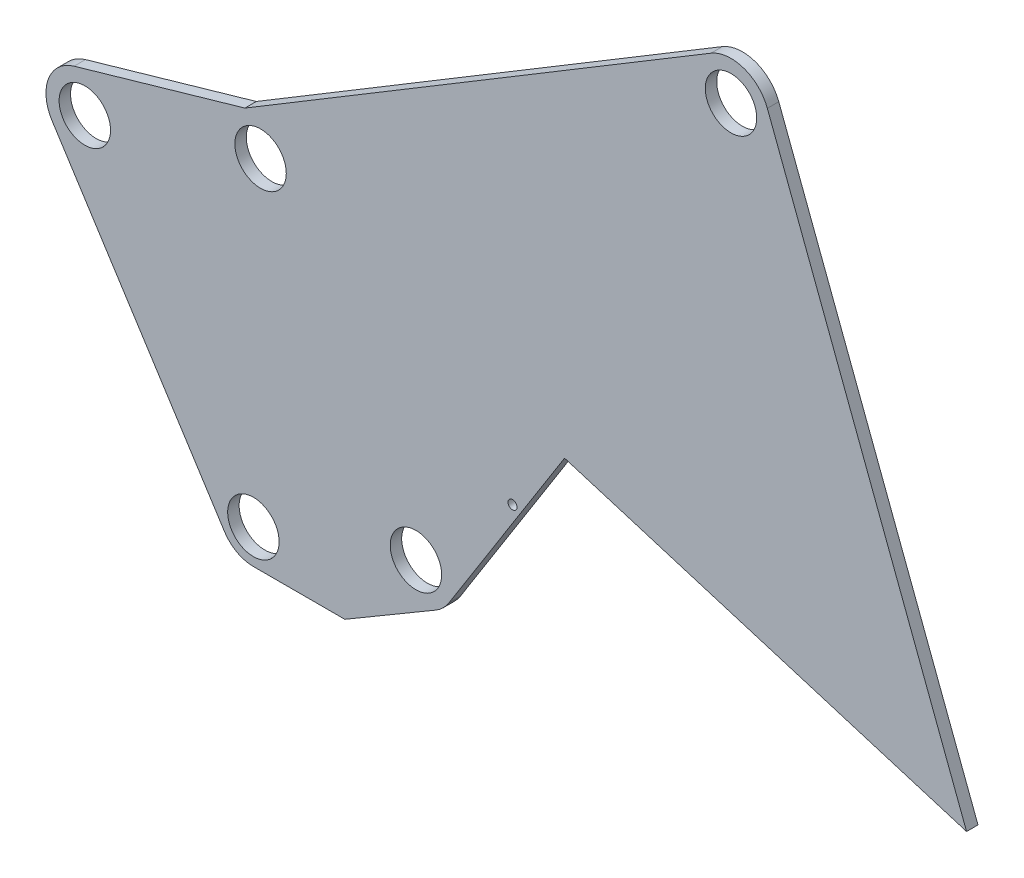
ISO-10303-21;
HEADER;
FILE_DESCRIPTION(('STEP AP214'),'2;1');
FILE_NAME('part.step','',(''),(''),'','','');
FILE_SCHEMA(('AUTOMOTIVE_DESIGN { 1 0 10303 214 1 1 1 1 }'));
ENDSEC;
DATA;
#1=APPLICATION_CONTEXT('core data for automotive mechanical design processes');
#2=APPLICATION_PROTOCOL_DEFINITION('international standard','automotive_design',2000,#1);
#3=PRODUCT_CONTEXT('',#1,'mechanical');
#4=PRODUCT('Part','Part','',(#3));
#5=PRODUCT_RELATED_PRODUCT_CATEGORY('part','',(#4));
#6=PRODUCT_DEFINITION_FORMATION('','',#4);
#7=PRODUCT_DEFINITION_CONTEXT('part definition',#1,'design');
#8=PRODUCT_DEFINITION('design','',#6,#7);
#9=PRODUCT_DEFINITION_SHAPE('','',#8);
#10=(LENGTH_UNIT() NAMED_UNIT(*) SI_UNIT(.MILLI.,.METRE.));
#11=(NAMED_UNIT(*) PLANE_ANGLE_UNIT() SI_UNIT($,.RADIAN.));
#12=(NAMED_UNIT(*) SI_UNIT($,.STERADIAN.) SOLID_ANGLE_UNIT());
#13=UNCERTAINTY_MEASURE_WITH_UNIT(LENGTH_MEASURE(1.E-05),#10,'distance_accuracy_value','');
#14=(GEOMETRIC_REPRESENTATION_CONTEXT(3) GLOBAL_UNCERTAINTY_ASSIGNED_CONTEXT((#13)) GLOBAL_UNIT_ASSIGNED_CONTEXT((#10,
#11,#12)) REPRESENTATION_CONTEXT('',''));
#15=CARTESIAN_POINT('',(0.,0.,0.));
#16=DIRECTION('',(0.,0.,1.));
#17=DIRECTION('',(1.,0.,0.));
#18=AXIS2_PLACEMENT_3D('',#15,#16,#17);
#19=CARTESIAN_POINT('',(-28.401709478263,48.3241414593411,6.35));
#20=DIRECTION('',(-0.506698596321132,0.862123269890214,0.));
#21=DIRECTION('',(-0.862123269890214,-0.506698596321132,0.));
#22=AXIS2_PLACEMENT_3D('',#19,#20,#21);
#23=PLANE('',#22);
#24=DIRECTION('',(0.862123269890214,0.506698596321132,0.));
#25=VECTOR('',#24,1.);
#26=CARTESIAN_POINT('',(-28.401709478263,48.3241414593411,0.));
#27=LINE('',#26,#25);
#28=CARTESIAN_POINT('',(-110.622909915789,3.67206265394771E-11,0.));
#29=VERTEX_POINT('',#28);
#30=CARTESIAN_POINT('',(-60.1803773054267,29.646758603154,0.));
#31=VERTEX_POINT('',#30);
#32=EDGE_CURVE('E198',#29,#31,#27,.T.);
#33=ORIENTED_EDGE('',*,*,#32,.T.);
#34=DIRECTION('',(0.,0.,-1.));
#35=VECTOR('',#34,1.);
#36=CARTESIAN_POINT('',(-60.1803773054267,29.646758603154,6.35));
#37=LINE('',#36,#35);
#38=CARTESIAN_POINT('',(-60.1803773054267,29.646758603154,6.35));
#39=VERTEX_POINT('',#38);
#40=EDGE_CURVE('E11',#39,#31,#37,.T.);
#41=ORIENTED_EDGE('',*,*,#40,.F.);
#42=DIRECTION('',(0.862123269890214,0.506698596321132,0.));
#43=VECTOR('',#42,1.);
#44=CARTESIAN_POINT('',(-28.401709478263,48.3241414593411,6.35));
#45=LINE('',#44,#43);
#46=CARTESIAN_POINT('',(-110.622909915789,3.67206265394771E-11,6.35));
#47=VERTEX_POINT('',#46);
#48=EDGE_CURVE('E263',#47,#39,#45,.T.);
#49=ORIENTED_EDGE('',*,*,#48,.F.);
#50=DIRECTION('',(0.,0.,-1.));
#51=VECTOR('',#50,1.);
#52=CARTESIAN_POINT('',(-110.622909915789,3.67206265394771E-11,6.35));
#53=LINE('',#52,#51);
#54=EDGE_CURVE('E197',#47,#29,#53,.T.);
#55=ORIENTED_EDGE('',*,*,#54,.T.);
#56=EDGE_LOOP('',(#33,#41,#49,#55));
#57=FACE_BOUND('',#56,.T.);
#58=ADVANCED_FACE('F45',(#57),#23,.F.);
#59=CARTESIAN_POINT('',(-71.1199999999939,48.2600000000735,6.35));
#60=DIRECTION('',(0.,0.,-1.));
#61=DIRECTION('',(-1.,0.,0.));
#62=AXIS2_PLACEMENT_3D('',#59,#60,#61);
#63=CYLINDRICAL_SURFACE('',#62,21.5899999999761);
#64=CARTESIAN_POINT('',(-71.1199999999939,48.2600000000735,0.));
#65=DIRECTION('',(0.,0.,1.));
#66=DIRECTION('',(1.,0.,0.));
#67=AXIS2_PLACEMENT_3D('',#64,#65,#66);
#68=CIRCLE('',#67,21.5899999999761);
#69=CARTESIAN_POINT('',(-52.8649638181614,36.732565159682,0.));
#70=VERTEX_POINT('',#69);
#71=EDGE_CURVE('E202',#31,#70,#68,.T.);
#72=ORIENTED_EDGE('',*,*,#71,.T.);
#73=DIRECTION('',(0.,0.,-1.));
#74=VECTOR('',#73,1.);
#75=CARTESIAN_POINT('',(-52.8649638181614,36.732565159682,6.35));
#76=LINE('',#75,#74);
#77=CARTESIAN_POINT('',(-52.8649638181614,36.732565159682,6.35));
#78=VERTEX_POINT('',#77);
#79=EDGE_CURVE('E54',#78,#70,#76,.T.);
#80=ORIENTED_EDGE('',*,*,#79,.F.);
#81=CARTESIAN_POINT('',(-71.1199999999939,48.2600000000735,6.35));
#82=DIRECTION('',(0.,0.,1.));
#83=DIRECTION('',(1.,0.,0.));
#84=AXIS2_PLACEMENT_3D('',#81,#82,#83);
#85=CIRCLE('',#84,21.5899999999761);
#86=EDGE_CURVE('E116',#39,#78,#85,.T.);
#87=ORIENTED_EDGE('',*,*,#86,.F.);
#88=ORIENTED_EDGE('',*,*,#40,.T.);
#89=EDGE_LOOP('',(#72,#80,#87,#88));
#90=FACE_BOUND('',#89,.T.);
#91=ADVANCED_FACE('F295',(#90),#63,.T.);
#92=CARTESIAN_POINT('',(-54.377384872712,34.3374702009576,6.35));
#93=DIRECTION('',(0.845532013980666,-0.533924726280585,0.));
#94=DIRECTION('',(0.533924726280585,0.845532013980667,0.));
#95=AXIS2_PLACEMENT_3D('',#92,#93,#94);
#96=PLANE('',#95);
#97=DIRECTION('',(-0.533924726280585,-0.845532013980667,0.));
#98=VECTOR('',#97,1.);
#99=CARTESIAN_POINT('',(-54.377384872712,34.3374702009576,0.));
#100=LINE('',#99,#98);
#101=CARTESIAN_POINT('',(11.4463859597402,138.577080730845,0.));
#102=VERTEX_POINT('',#101);
#103=EDGE_CURVE('E206',#102,#70,#100,.T.);
#104=ORIENTED_EDGE('',*,*,#103,.F.);
#105=DIRECTION('',(0.,0.,-1.));
#106=VECTOR('',#105,1.);
#107=CARTESIAN_POINT('',(11.4463859597402,138.577080730845,6.35));
#108=LINE('',#107,#106);
#109=CARTESIAN_POINT('',(11.4463859597402,138.577080730845,6.35));
#110=VERTEX_POINT('',#109);
#111=EDGE_CURVE('E286',#110,#102,#108,.T.);
#112=ORIENTED_EDGE('',*,*,#111,.F.);
#113=DIRECTION('',(-0.533924726280585,-0.845532013980667,0.));
#114=VECTOR('',#113,1.);
#115=CARTESIAN_POINT('',(-54.377384872712,34.3374702009576,6.35));
#116=LINE('',#115,#114);
#117=EDGE_CURVE('E294',#110,#78,#116,.T.);
#118=ORIENTED_EDGE('',*,*,#117,.T.);
#119=ORIENTED_EDGE('',*,*,#79,.T.);
#120=EDGE_LOOP('',(#104,#112,#118,#119));
#121=FACE_BOUND('',#120,.T.);
#122=ADVANCED_FACE('F292',(#121),#96,.T.);
#123=CARTESIAN_POINT('',(39.5684231433015,130.018740093729,6.35));
#124=DIRECTION('',(-0.291144795275642,-0.956678999552046,0.));
#125=DIRECTION('',(0.956678999552047,-0.291144795275642,0.));
#126=AXIS2_PLACEMENT_3D('',#123,#124,#125);
#127=PLANE('',#126);
#128=DIRECTION('',(-0.956678999552047,0.291144795275642,0.));
#129=VECTOR('',#128,1.);
#130=CARTESIAN_POINT('',(39.5684231433015,130.018740093729,0.));
#131=LINE('',#130,#129);
#132=CARTESIAN_POINT('',(234.791292485708,70.6068345805613,0.));
#133=VERTEX_POINT('',#132);
#134=EDGE_CURVE('E210',#133,#102,#131,.T.);
#135=ORIENTED_EDGE('',*,*,#134,.F.);
#136=DIRECTION('',(0.,0.,-1.));
#137=VECTOR('',#136,1.);
#138=CARTESIAN_POINT('',(234.791292485708,70.6068345805613,6.35));
#139=LINE('',#138,#137);
#140=CARTESIAN_POINT('',(234.791292485708,70.6068345805613,6.35));
#141=VERTEX_POINT('',#140);
#142=EDGE_CURVE('E283',#141,#133,#139,.T.);
#143=ORIENTED_EDGE('',*,*,#142,.F.);
#144=DIRECTION('',(-0.956678999552047,0.291144795275642,0.));
#145=VECTOR('',#144,1.);
#146=CARTESIAN_POINT('',(39.5684231433015,130.018740093729,6.35));
#147=LINE('',#146,#145);
#148=EDGE_CURVE('E308',#141,#110,#147,.T.);
#149=ORIENTED_EDGE('',*,*,#148,.T.);
#150=ORIENTED_EDGE('',*,*,#111,.T.);
#151=EDGE_LOOP('',(#135,#143,#149,#150));
#152=FACE_BOUND('',#151,.T.);
#153=ADVANCED_FACE('F305',(#152),#127,.T.);
#154=CARTESIAN_POINT('',(228.770055306045,86.5265569341366,6.35));
#155=DIRECTION('',(0.93533372917064,0.353766611024476,0.));
#156=DIRECTION('',(-0.353766611024476,0.935333729170641,0.));
#157=AXIS2_PLACEMENT_3D('',#154,#155,#156);
#158=PLANE('',#157);
#159=DIRECTION('',(0.353766611024476,-0.93533372917064,0.));
#160=VECTOR('',#159,1.);
#161=CARTESIAN_POINT('',(228.770055306045,86.5265569341366,0.));
#162=LINE('',#161,#160);
#163=CARTESIAN_POINT('',(124.110934059133,363.237821132055,0.));
#164=VERTEX_POINT('',#163);
#165=EDGE_CURVE('E214',#164,#133,#162,.T.);
#166=ORIENTED_EDGE('',*,*,#165,.F.);
#167=DIRECTION('',(0.,0.,-1.));
#168=VECTOR('',#167,1.);
#169=CARTESIAN_POINT('',(124.110934059133,363.237821132055,6.35));
#170=LINE('',#169,#168);
#171=CARTESIAN_POINT('',(124.110934059133,363.237821132055,6.35));
#172=VERTEX_POINT('',#171);
#173=EDGE_CURVE('E280',#172,#164,#170,.T.);
#174=ORIENTED_EDGE('',*,*,#173,.F.);
#175=DIRECTION('',(0.353766611024476,-0.93533372917064,0.));
#176=VECTOR('',#175,1.);
#177=CARTESIAN_POINT('',(228.770055306045,86.5265569341366,6.35));
#178=LINE('',#177,#176);
#179=EDGE_CURVE('E315',#172,#141,#178,.T.);
#180=ORIENTED_EDGE('',*,*,#179,.T.);
#181=ORIENTED_EDGE('',*,*,#142,.T.);
#182=EDGE_LOOP('',(#166,#174,#180,#181));
#183=FACE_BOUND('',#182,.T.);
#184=ADVANCED_FACE('F532',(#183),#158,.T.);
#185=CARTESIAN_POINT('',(103.917078846339,355.600000000037,6.35));
#186=DIRECTION('',(0.,0.,-1.));
#187=DIRECTION('',(-1.,0.,0.));
#188=AXIS2_PLACEMENT_3D('',#185,#186,#187);
#189=CYLINDRICAL_SURFACE('',#188,21.59);
#190=CARTESIAN_POINT('',(103.917078846339,355.600000000037,0.));
#191=DIRECTION('',(0.,0.,1.));
#192=DIRECTION('',(1.,0.,0.));
#193=AXIS2_PLACEMENT_3D('',#190,#191,#192);
#194=CIRCLE('',#193,21.59);
#195=CARTESIAN_POINT('',(92.7821589025102,374.0970716019,0.));
#196=VERTEX_POINT('',#195);
#197=EDGE_CURVE('E218',#164,#196,#194,.T.);
#198=ORIENTED_EDGE('',*,*,#197,.T.);
#199=DIRECTION('',(0.,0.,-1.));
#200=VECTOR('',#199,1.);
#201=CARTESIAN_POINT('',(92.7821589025102,374.0970716019,6.35));
#202=LINE('',#201,#200);
#203=CARTESIAN_POINT('',(92.7821589025102,374.0970716019,6.35));
#204=VERTEX_POINT('',#203);
#205=EDGE_CURVE('E276',#204,#196,#202,.T.);
#206=ORIENTED_EDGE('',*,*,#205,.F.);
#207=CARTESIAN_POINT('',(103.917078846339,355.600000000037,6.35));
#208=DIRECTION('',(0.,0.,1.));
#209=DIRECTION('',(1.,0.,0.));
#210=AXIS2_PLACEMENT_3D('',#207,#208,#209);
#211=CIRCLE('',#210,21.59);
#212=EDGE_CURVE('E322',#172,#204,#211,.T.);
#213=ORIENTED_EDGE('',*,*,#212,.F.);
#214=ORIENTED_EDGE('',*,*,#173,.T.);
#215=EDGE_LOOP('',(#198,#206,#213,#214));
#216=FACE_BOUND('',#215,.T.);
#217=ADVANCED_FACE('F523',(#216),#189,.T.);
#218=CARTESIAN_POINT('',(-140.619240322013,233.59343129156,6.35));
#219=DIRECTION('',(0.515744323475217,-0.856742547562038,0.));
#220=DIRECTION('',(0.856742547562038,0.515744323475217,0.));
#221=AXIS2_PLACEMENT_3D('',#218,#219,#220);
#222=PLANE('',#221);
#223=DIRECTION('',(-0.856742547562038,-0.515744323475217,0.));
#224=VECTOR('',#223,1.);
#225=CARTESIAN_POINT('',(-140.619240322013,233.59343129156,0.));
#226=LINE('',#225,#224);
#227=CARTESIAN_POINT('',(-166.143530668681,218.228246155737,0.));
#228=VERTEX_POINT('',#227);
#229=EDGE_CURVE('E221',#196,#228,#226,.T.);
#230=ORIENTED_EDGE('',*,*,#229,.T.);
#231=DIRECTION('',(0.,0.,-1.));
#232=VECTOR('',#231,1.);
#233=CARTESIAN_POINT('',(-166.143530668681,218.228246155737,6.35));
#234=LINE('',#233,#232);
#235=CARTESIAN_POINT('',(-166.143530668681,218.228246155737,6.35));
#236=VERTEX_POINT('',#235);
#237=EDGE_CURVE('E273',#236,#228,#234,.T.);
#238=ORIENTED_EDGE('',*,*,#237,.F.);
#239=DIRECTION('',(-0.856742547562038,-0.515744323475217,0.));
#240=VECTOR('',#239,1.);
#241=CARTESIAN_POINT('',(-140.619240322013,233.59343129156,6.35));
#242=LINE('',#241,#240);
#243=EDGE_CURVE('E325',#204,#236,#242,.T.);
#244=ORIENTED_EDGE('',*,*,#243,.F.);
#245=ORIENTED_EDGE('',*,*,#205,.T.);
#246=EDGE_LOOP('',(#230,#238,#244,#245));
#247=FACE_BOUND('',#246,.T.);
#248=ADVANCED_FACE('F337',(#247),#222,.F.);
#249=CARTESIAN_POINT('',(-70.6696864904669,245.690103730274,6.35));
#250=DIRECTION('',(-0.27642947374798,0.961034206489766,0.));
#251=DIRECTION('',(-0.961034206489766,-0.27642947374798,0.));
#252=AXIS2_PLACEMENT_3D('',#249,#250,#251);
#253=PLANE('',#252);
#254=DIRECTION('',(0.961034206489766,0.27642947374798,0.));
#255=VECTOR('',#254,1.);
#256=CARTESIAN_POINT('',(-70.6696864904669,245.690103730274,0.));
#257=LINE('',#256,#255);
#258=CARTESIAN_POINT('',(-261.052984116868,190.928728518151,0.));
#259=VERTEX_POINT('',#258);
#260=EDGE_CURVE('E225',#259,#228,#257,.T.);
#261=ORIENTED_EDGE('',*,*,#260,.F.);
#262=DIRECTION('',(0.,0.,-1.));
#263=VECTOR('',#262,1.);
#264=CARTESIAN_POINT('',(-261.052984116868,190.928728518151,6.35));
#265=LINE('',#264,#263);
#266=CARTESIAN_POINT('',(-261.052984116868,190.928728518151,6.35));
#267=VERTEX_POINT('',#266);
#268=EDGE_CURVE('E270',#267,#259,#265,.T.);
#269=ORIENTED_EDGE('',*,*,#268,.F.);
#270=DIRECTION('',(0.961034206489766,0.27642947374798,0.));
#271=VECTOR('',#270,1.);
#272=CARTESIAN_POINT('',(-70.6696864904669,245.690103730274,6.35));
#273=LINE('',#272,#271);
#274=EDGE_CURVE('E167',#267,#236,#273,.T.);
#275=ORIENTED_EDGE('',*,*,#274,.T.);
#276=ORIENTED_EDGE('',*,*,#237,.T.);
#277=EDGE_LOOP('',(#261,#269,#275,#276));
#278=FACE_BOUND('',#277,.T.);
#279=ADVANCED_FACE('F331',(#278),#253,.T.);
#280=CARTESIAN_POINT('',(-255.084871778649,170.180000000037,6.35));
#281=DIRECTION('',(0.,0.,-1.));
#282=DIRECTION('',(-1.,0.,0.));
#283=AXIS2_PLACEMENT_3D('',#280,#281,#282);
#284=CYLINDRICAL_SURFACE('',#283,21.59);
#285=CARTESIAN_POINT('',(-255.084871778649,170.180000000037,0.));
#286=DIRECTION('',(0.,0.,1.));
#287=DIRECTION('',(1.,0.,0.));
#288=AXIS2_PLACEMENT_3D('',#285,#286,#287);
#289=CIRCLE('',#288,21.59);
#290=CARTESIAN_POINT('',(-273.272024249255,158.545758081848,0.));
#291=VERTEX_POINT('',#290);
#292=EDGE_CURVE('E229',#259,#291,#289,.T.);
#293=ORIENTED_EDGE('',*,*,#292,.T.);
#294=DIRECTION('',(0.,0.,-1.));
#295=VECTOR('',#294,1.);
#296=CARTESIAN_POINT('',(-273.272024249255,158.545758081848,6.35));
#297=LINE('',#296,#295);
#298=CARTESIAN_POINT('',(-273.272024249255,158.545758081848,6.35));
#299=VERTEX_POINT('',#298);
#300=EDGE_CURVE('E151',#299,#291,#297,.T.);
#301=ORIENTED_EDGE('',*,*,#300,.F.);
#302=CARTESIAN_POINT('',(-255.084871778649,170.180000000037,6.35));
#303=DIRECTION('',(0.,0.,1.));
#304=DIRECTION('',(1.,0.,0.));
#305=AXIS2_PLACEMENT_3D('',#302,#303,#304);
#306=CIRCLE('',#305,21.59);
#307=EDGE_CURVE('E162',#267,#299,#306,.T.);
#308=ORIENTED_EDGE('',*,*,#307,.F.);
#309=ORIENTED_EDGE('',*,*,#268,.T.);
#310=EDGE_LOOP('',(#293,#301,#308,#309));
#311=FACE_BOUND('',#310,.T.);
#312=ADVANCED_FACE('F341',(#311),#284,.T.);
#313=CARTESIAN_POINT('',(-121.948421791975,-78.0098722415308,6.35));
#314=DIRECTION('',(-0.842387793914108,-0.538871788707223,0.));
#315=DIRECTION('',(0.538871788707223,-0.842387793914108,0.));
#316=AXIS2_PLACEMENT_3D('',#313,#314,#315);
#317=PLANE('',#316);
#318=DIRECTION('',(-0.538871788707223,0.842387793914108,0.));
#319=VECTOR('',#318,1.);
#320=CARTESIAN_POINT('',(-121.948421791975,-78.0098722415308,0.));
#321=LINE('',#320,#319);
#322=CARTESIAN_POINT('',(-177.470397389852,8.78449242516413,0.));
#323=VERTEX_POINT('',#322);
#324=EDGE_CURVE('E149',#323,#291,#321,.T.);
#325=ORIENTED_EDGE('',*,*,#324,.F.);
#326=DIRECTION('',(0.,0.,-1.));
#327=VECTOR('',#326,1.);
#328=CARTESIAN_POINT('',(-177.470397389852,8.78449242516413,6.35));
#329=LINE('',#328,#327);
#330=CARTESIAN_POINT('',(-177.470397389852,8.78449242516413,6.35));
#331=VERTEX_POINT('',#330);
#332=EDGE_CURVE('E143',#331,#323,#329,.T.);
#333=ORIENTED_EDGE('',*,*,#332,.F.);
#334=DIRECTION('',(-0.538871788707223,0.842387793914108,0.));
#335=VECTOR('',#334,1.);
#336=CARTESIAN_POINT('',(-121.948421791975,-78.0098722415308,6.35));
#337=LINE('',#336,#335);
#338=EDGE_CURVE('E147',#331,#299,#337,.T.);
#339=ORIENTED_EDGE('',*,*,#338,.T.);
#340=ORIENTED_EDGE('',*,*,#300,.T.);
#341=EDGE_LOOP('',(#325,#333,#339,#340));
#342=FACE_BOUND('',#341,.T.);
#343=ADVANCED_FACE('F145',(#342),#317,.T.);
#344=CARTESIAN_POINT('',(-161.422909915789,19.0500000000367,6.35));
#345=DIRECTION('',(0.,0.,-1.));
#346=DIRECTION('',(-1.,0.,0.));
#347=AXIS2_PLACEMENT_3D('',#344,#345,#346);
#348=CYLINDRICAL_SURFACE('',#347,19.05);
#349=CARTESIAN_POINT('',(-161.422909915789,19.0500000000367,0.));
#350=DIRECTION('',(0.,0.,1.));
#351=DIRECTION('',(1.,0.,0.));
#352=AXIS2_PLACEMENT_3D('',#349,#350,#351);
#353=CIRCLE('',#352,19.05);
#354=CARTESIAN_POINT('',(-161.422909915789,3.67171570925251E-11,0.));
#355=VERTEX_POINT('',#354);
#356=EDGE_CURVE('E102',#323,#355,#353,.T.);
#357=ORIENTED_EDGE('',*,*,#356,.T.);
#358=DIRECTION('',(0.,0.,-1.));
#359=VECTOR('',#358,1.);
#360=CARTESIAN_POINT('',(-161.422909915789,3.67171570925251E-11,6.35));
#361=LINE('',#360,#359);
#362=CARTESIAN_POINT('',(-161.422909915789,3.67171570925251E-11,6.35));
#363=VERTEX_POINT('',#362);
#364=EDGE_CURVE('E152',#363,#355,#361,.T.);
#365=ORIENTED_EDGE('',*,*,#364,.F.);
#366=CARTESIAN_POINT('',(-161.422909915789,19.0500000000367,6.35));
#367=DIRECTION('',(0.,0.,1.));
#368=DIRECTION('',(1.,0.,0.));
#369=AXIS2_PLACEMENT_3D('',#366,#367,#368);
#370=CIRCLE('',#369,19.05);
#371=EDGE_CURVE('E154',#331,#363,#370,.T.);
#372=ORIENTED_EDGE('',*,*,#371,.F.);
#373=ORIENTED_EDGE('',*,*,#332,.T.);
#374=EDGE_LOOP('',(#357,#365,#372,#373));
#375=FACE_BOUND('',#374,.T.);
#376=ADVANCED_FACE('F155',(#375),#348,.T.);
#377=CARTESIAN_POINT('',(-17.4590101983024,101.721814698312,6.35));
#378=DIRECTION('',(0.,0.,-1.));
#379=DIRECTION('',(-1.,0.,0.));
#380=AXIS2_PLACEMENT_3D('',#377,#378,#379);
#381=CYLINDRICAL_SURFACE('',#380,2.48919999997612);
#382=CARTESIAN_POINT('',(-17.4590101983024,101.721814698312,6.35));
#383=DIRECTION('',(0.,0.,1.));
#384=DIRECTION('',(1.,0.,0.));
#385=AXIS2_PLACEMENT_3D('',#382,#383,#384);
#386=CIRCLE('',#385,2.48919999997612);
#387=CARTESIAN_POINT('',(-14.9698101983263,101.721814698312,6.35));
#388=VERTEX_POINT('',#387);
#389=EDGE_CURVE('E189',#388,#388,#386,.T.);
#390=ORIENTED_EDGE('',*,*,#389,.T.);
#391=EDGE_LOOP('',(#390));
#392=FACE_BOUND('',#391,.T.);
#393=CARTESIAN_POINT('',(-17.4590101983024,101.721814698312,0.));
#394=DIRECTION('',(0.,0.,1.));
#395=DIRECTION('',(1.,0.,0.));
#396=AXIS2_PLACEMENT_3D('',#393,#394,#395);
#397=CIRCLE('',#396,2.48919999997612);
#398=CARTESIAN_POINT('',(-14.9698101983263,101.721814698312,0.));
#399=VERTEX_POINT('',#398);
#400=EDGE_CURVE('E255',#399,#399,#397,.T.);
#401=ORIENTED_EDGE('',*,*,#400,.F.);
#402=EDGE_LOOP('',(#401));
#403=FACE_BOUND('',#402,.T.);
#404=ADVANCED_FACE('F373',(#392,#403),#381,.F.);
#405=CARTESIAN_POINT('',(103.917078846339,355.600000000037,6.35));
#406=DIRECTION('',(0.,0.,-1.));
#407=DIRECTION('',(-1.,0.,0.));
#408=AXIS2_PLACEMENT_3D('',#405,#406,#407);
#409=CYLINDRICAL_SURFACE('',#408,14.2875);
#410=CARTESIAN_POINT('',(103.917078846339,355.600000000037,6.35));
#411=DIRECTION('',(0.,0.,1.));
#412=DIRECTION('',(1.,0.,0.));
#413=AXIS2_PLACEMENT_3D('',#410,#411,#412);
#414=CIRCLE('',#413,14.2875);
#415=CARTESIAN_POINT('',(118.204578846339,355.600000000037,6.35));
#416=VERTEX_POINT('',#415);
#417=EDGE_CURVE('E185',#416,#416,#414,.T.);
#418=ORIENTED_EDGE('',*,*,#417,.T.);
#419=EDGE_LOOP('',(#418));
#420=FACE_BOUND('',#419,.T.);
#421=CARTESIAN_POINT('',(103.917078846339,355.600000000037,0.));
#422=DIRECTION('',(0.,0.,1.));
#423=DIRECTION('',(1.,0.,0.));
#424=AXIS2_PLACEMENT_3D('',#421,#422,#423);
#425=CIRCLE('',#424,14.2875);
#426=CARTESIAN_POINT('',(118.204578846339,355.600000000037,0.));
#427=VERTEX_POINT('',#426);
#428=EDGE_CURVE('E251',#427,#427,#425,.T.);
#429=ORIENTED_EDGE('',*,*,#428,.F.);
#430=EDGE_LOOP('',(#429));
#431=FACE_BOUND('',#430,.T.);
#432=ADVANCED_FACE('F377',(#420,#431),#409,.F.);
#433=CARTESIAN_POINT('',(-157.443796399291,198.265234532833,6.35));
#434=DIRECTION('',(0.,0.,-1.));
#435=DIRECTION('',(-1.,0.,0.));
#436=AXIS2_PLACEMENT_3D('',#433,#434,#435);
#437=CYLINDRICAL_SURFACE('',#436,14.2875);
#438=CARTESIAN_POINT('',(-157.443796399291,198.265234532833,6.35));
#439=DIRECTION('',(0.,0.,1.));
#440=DIRECTION('',(1.,0.,0.));
#441=AXIS2_PLACEMENT_3D('',#438,#439,#440);
#442=CIRCLE('',#441,14.2875);
#443=CARTESIAN_POINT('',(-143.156296399291,198.265234532833,6.35));
#444=VERTEX_POINT('',#443);
#445=EDGE_CURVE('E181',#444,#444,#442,.T.);
#446=ORIENTED_EDGE('',*,*,#445,.T.);
#447=EDGE_LOOP('',(#446));
#448=FACE_BOUND('',#447,.T.);
#449=CARTESIAN_POINT('',(-157.443796399291,198.265234532833,0.));
#450=DIRECTION('',(0.,0.,1.));
#451=DIRECTION('',(1.,0.,0.));
#452=AXIS2_PLACEMENT_3D('',#449,#450,#451);
#453=CIRCLE('',#452,14.2875);
#454=CARTESIAN_POINT('',(-143.156296399291,198.265234532833,0.));
#455=VERTEX_POINT('',#454);
#456=EDGE_CURVE('E247',#455,#455,#453,.T.);
#457=ORIENTED_EDGE('',*,*,#456,.F.);
#458=EDGE_LOOP('',(#457));
#459=FACE_BOUND('',#458,.T.);
#460=ADVANCED_FACE('F383',(#448,#459),#437,.F.);
#461=CARTESIAN_POINT('',(-255.084871778649,170.180000000037,6.35));
#462=DIRECTION('',(0.,0.,-1.));
#463=DIRECTION('',(-1.,0.,0.));
#464=AXIS2_PLACEMENT_3D('',#461,#462,#463);
#465=CYLINDRICAL_SURFACE('',#464,14.2875);
#466=CARTESIAN_POINT('',(-255.084871778649,170.180000000037,6.35));
#467=DIRECTION('',(0.,0.,1.));
#468=DIRECTION('',(1.,0.,0.));
#469=AXIS2_PLACEMENT_3D('',#466,#467,#468);
#470=CIRCLE('',#469,14.2875);
#471=CARTESIAN_POINT('',(-240.797371778649,170.180000000037,6.35));
#472=VERTEX_POINT('',#471);
#473=EDGE_CURVE('E177',#472,#472,#470,.T.);
#474=ORIENTED_EDGE('',*,*,#473,.T.);
#475=EDGE_LOOP('',(#474));
#476=FACE_BOUND('',#475,.T.);
#477=CARTESIAN_POINT('',(-255.084871778649,170.180000000037,0.));
#478=DIRECTION('',(0.,0.,1.));
#479=DIRECTION('',(1.,0.,0.));
#480=AXIS2_PLACEMENT_3D('',#477,#478,#479);
#481=CIRCLE('',#480,14.2875);
#482=CARTESIAN_POINT('',(-240.797371778649,170.180000000037,0.));
#483=VERTEX_POINT('',#482);
#484=EDGE_CURVE('E243',#483,#483,#481,.T.);
#485=ORIENTED_EDGE('',*,*,#484,.F.);
#486=EDGE_LOOP('',(#485));
#487=FACE_BOUND('',#486,.T.);
#488=ADVANCED_FACE('F367',(#476,#487),#465,.F.);
#489=CARTESIAN_POINT('',(-161.422909915789,19.0500000000367,6.35));
#490=DIRECTION('',(0.,0.,-1.));
#491=DIRECTION('',(-1.,0.,0.));
#492=AXIS2_PLACEMENT_3D('',#489,#490,#491);
#493=CYLINDRICAL_SURFACE('',#492,14.2875);
#494=CARTESIAN_POINT('',(-161.422909915789,19.0500000000367,6.35));
#495=DIRECTION('',(0.,0.,1.));
#496=DIRECTION('',(1.,0.,0.));
#497=AXIS2_PLACEMENT_3D('',#494,#495,#496);
#498=CIRCLE('',#497,14.2875);
#499=CARTESIAN_POINT('',(-147.135409915789,19.0500000000367,6.35));
#500=VERTEX_POINT('',#499);
#501=EDGE_CURVE('E173',#500,#500,#498,.T.);
#502=ORIENTED_EDGE('',*,*,#501,.T.);
#503=EDGE_LOOP('',(#502));
#504=FACE_BOUND('',#503,.T.);
#505=CARTESIAN_POINT('',(-161.422909915789,19.0500000000367,0.));
#506=DIRECTION('',(0.,0.,1.));
#507=DIRECTION('',(1.,0.,0.));
#508=AXIS2_PLACEMENT_3D('',#505,#506,#507);
#509=CIRCLE('',#508,14.2875);
#510=CARTESIAN_POINT('',(-147.135409915789,19.0500000000367,0.));
#511=VERTEX_POINT('',#510);
#512=EDGE_CURVE('E239',#511,#511,#509,.T.);
#513=ORIENTED_EDGE('',*,*,#512,.F.);
#514=EDGE_LOOP('',(#513));
#515=FACE_BOUND('',#514,.T.);
#516=ADVANCED_FACE('F359',(#504,#515),#493,.F.);
#517=CARTESIAN_POINT('',(0.,3.67208084305445E-11,6.35));
#518=DIRECTION('',(0.,1.,0.));
#519=DIRECTION('',(-1.,0.,0.));
#520=AXIS2_PLACEMENT_3D('',#517,#518,#519);
#521=PLANE('',#520);
#522=DIRECTION('',(1.,0.,0.));
#523=VECTOR('',#522,1.);
#524=CARTESIAN_POINT('',(0.,3.67208084305445E-11,0.));
#525=LINE('',#524,#523);
#526=EDGE_CURVE('E108',#355,#29,#525,.T.);
#527=ORIENTED_EDGE('',*,*,#526,.T.);
#528=ORIENTED_EDGE('',*,*,#54,.F.);
#529=DIRECTION('',(1.,0.,0.));
#530=VECTOR('',#529,1.);
#531=CARTESIAN_POINT('',(0.,3.67208084305445E-11,6.35));
#532=LINE('',#531,#530);
#533=EDGE_CURVE('E62',#363,#47,#532,.T.);
#534=ORIENTED_EDGE('',*,*,#533,.F.);
#535=ORIENTED_EDGE('',*,*,#364,.T.);
#536=EDGE_LOOP('',(#527,#528,#534,#535));
#537=FACE_BOUND('',#536,.T.);
#538=ADVANCED_FACE('F356',(#537),#521,.F.);
#539=CARTESIAN_POINT('',(-71.1199999999939,48.2600000000735,6.35));
#540=DIRECTION('',(0.,0.,-1.));
#541=DIRECTION('',(-1.,0.,0.));
#542=AXIS2_PLACEMENT_3D('',#539,#540,#541);
#543=CYLINDRICAL_SURFACE('',#542,14.287499999976);
#544=CARTESIAN_POINT('',(-71.1199999999939,48.2600000000735,6.35));
#545=DIRECTION('',(0.,0.,1.));
#546=DIRECTION('',(1.,0.,0.));
#547=AXIS2_PLACEMENT_3D('',#544,#545,#546);
#548=CIRCLE('',#547,14.287499999976);
#549=CARTESIAN_POINT('',(-56.8325000000178,48.2600000000735,6.35));
#550=VERTEX_POINT('',#549);
#551=EDGE_CURVE('E193',#550,#550,#548,.T.);
#552=ORIENTED_EDGE('',*,*,#551,.T.);
#553=EDGE_LOOP('',(#552));
#554=FACE_BOUND('',#553,.T.);
#555=CARTESIAN_POINT('',(-71.1199999999939,48.2600000000735,0.));
#556=DIRECTION('',(0.,0.,1.));
#557=DIRECTION('',(1.,0.,0.));
#558=AXIS2_PLACEMENT_3D('',#555,#556,#557);
#559=CIRCLE('',#558,14.287499999976);
#560=CARTESIAN_POINT('',(-56.8325000000178,48.2600000000735,0.));
#561=VERTEX_POINT('',#560);
#562=EDGE_CURVE('E259',#561,#561,#559,.T.);
#563=ORIENTED_EDGE('',*,*,#562,.F.);
#564=EDGE_LOOP('',(#563));
#565=FACE_BOUND('',#564,.T.);
#566=ADVANCED_FACE('F358',(#554,#565),#543,.F.);
#567=CARTESIAN_POINT('',(0.,0.,6.35));
#568=DIRECTION('',(0.,0.,1.));
#569=DIRECTION('',(1.,0.,0.));
#570=AXIS2_PLACEMENT_3D('',#567,#568,#569);
#571=PLANE('',#570);
#572=ORIENTED_EDGE('',*,*,#48,.T.);
#573=ORIENTED_EDGE('',*,*,#86,.T.);
#574=ORIENTED_EDGE('',*,*,#117,.F.);
#575=ORIENTED_EDGE('',*,*,#148,.F.);
#576=ORIENTED_EDGE('',*,*,#179,.F.);
#577=ORIENTED_EDGE('',*,*,#212,.T.);
#578=ORIENTED_EDGE('',*,*,#243,.T.);
#579=ORIENTED_EDGE('',*,*,#274,.F.);
#580=ORIENTED_EDGE('',*,*,#307,.T.);
#581=ORIENTED_EDGE('',*,*,#338,.F.);
#582=ORIENTED_EDGE('',*,*,#371,.T.);
#583=ORIENTED_EDGE('',*,*,#533,.T.);
#584=EDGE_LOOP('',(#572,#573,#574,#575,#576,#577,#578,#579,#580,#581,#582,#583));
#585=FACE_BOUND('',#584,.T.);
#586=ORIENTED_EDGE('',*,*,#501,.F.);
#587=EDGE_LOOP('',(#586));
#588=FACE_BOUND('',#587,.T.);
#589=ORIENTED_EDGE('',*,*,#473,.F.);
#590=EDGE_LOOP('',(#589));
#591=FACE_BOUND('',#590,.T.);
#592=ORIENTED_EDGE('',*,*,#445,.F.);
#593=EDGE_LOOP('',(#592));
#594=FACE_BOUND('',#593,.T.);
#595=ORIENTED_EDGE('',*,*,#417,.F.);
#596=EDGE_LOOP('',(#595));
#597=FACE_BOUND('',#596,.T.);
#598=ORIENTED_EDGE('',*,*,#389,.F.);
#599=EDGE_LOOP('',(#598));
#600=FACE_BOUND('',#599,.T.);
#601=ORIENTED_EDGE('',*,*,#551,.F.);
#602=EDGE_LOOP('',(#601));
#603=FACE_BOUND('',#602,.T.);
#604=ADVANCED_FACE('F158',(#585,#588,#591,#594,#597,#600,#603),#571,.T.);
#605=CARTESIAN_POINT('',(0.,0.,0.));
#606=DIRECTION('',(0.,0.,1.));
#607=DIRECTION('',(1.,0.,0.));
#608=AXIS2_PLACEMENT_3D('',#605,#606,#607);
#609=PLANE('',#608);
#610=ORIENTED_EDGE('',*,*,#32,.F.);
#611=ORIENTED_EDGE('',*,*,#526,.F.);
#612=ORIENTED_EDGE('',*,*,#356,.F.);
#613=ORIENTED_EDGE('',*,*,#324,.T.);
#614=ORIENTED_EDGE('',*,*,#292,.F.);
#615=ORIENTED_EDGE('',*,*,#260,.T.);
#616=ORIENTED_EDGE('',*,*,#229,.F.);
#617=ORIENTED_EDGE('',*,*,#197,.F.);
#618=ORIENTED_EDGE('',*,*,#165,.T.);
#619=ORIENTED_EDGE('',*,*,#134,.T.);
#620=ORIENTED_EDGE('',*,*,#103,.T.);
#621=ORIENTED_EDGE('',*,*,#71,.F.);
#622=EDGE_LOOP('',(#610,#611,#612,#613,#614,#615,#616,#617,#618,#619,#620,#621));
#623=FACE_BOUND('',#622,.T.);
#624=ORIENTED_EDGE('',*,*,#512,.T.);
#625=EDGE_LOOP('',(#624));
#626=FACE_BOUND('',#625,.T.);
#627=ORIENTED_EDGE('',*,*,#484,.T.);
#628=EDGE_LOOP('',(#627));
#629=FACE_BOUND('',#628,.T.);
#630=ORIENTED_EDGE('',*,*,#456,.T.);
#631=EDGE_LOOP('',(#630));
#632=FACE_BOUND('',#631,.T.);
#633=ORIENTED_EDGE('',*,*,#428,.T.);
#634=EDGE_LOOP('',(#633));
#635=FACE_BOUND('',#634,.T.);
#636=ORIENTED_EDGE('',*,*,#400,.T.);
#637=EDGE_LOOP('',(#636));
#638=FACE_BOUND('',#637,.T.);
#639=ORIENTED_EDGE('',*,*,#562,.T.);
#640=EDGE_LOOP('',(#639));
#641=FACE_BOUND('',#640,.T.);
#642=ADVANCED_FACE('F299',(#623,#626,#629,#632,#635,#638,#641),#609,.F.);
#643=CLOSED_SHELL('',(#58,#91,#122,#153,#184,#217,#248,#279,#312,#343,#376,#404,#432,#460,#488,
#516,#538,#566,#604,#642));
#644=MANIFOLD_SOLID_BREP('B2',#643);
#645=ADVANCED_BREP_SHAPE_REPRESENTATION('',(#18,#644),#14);
#646=SHAPE_DEFINITION_REPRESENTATION(#9,#645);
ENDSEC;
END-ISO-10303-21;
